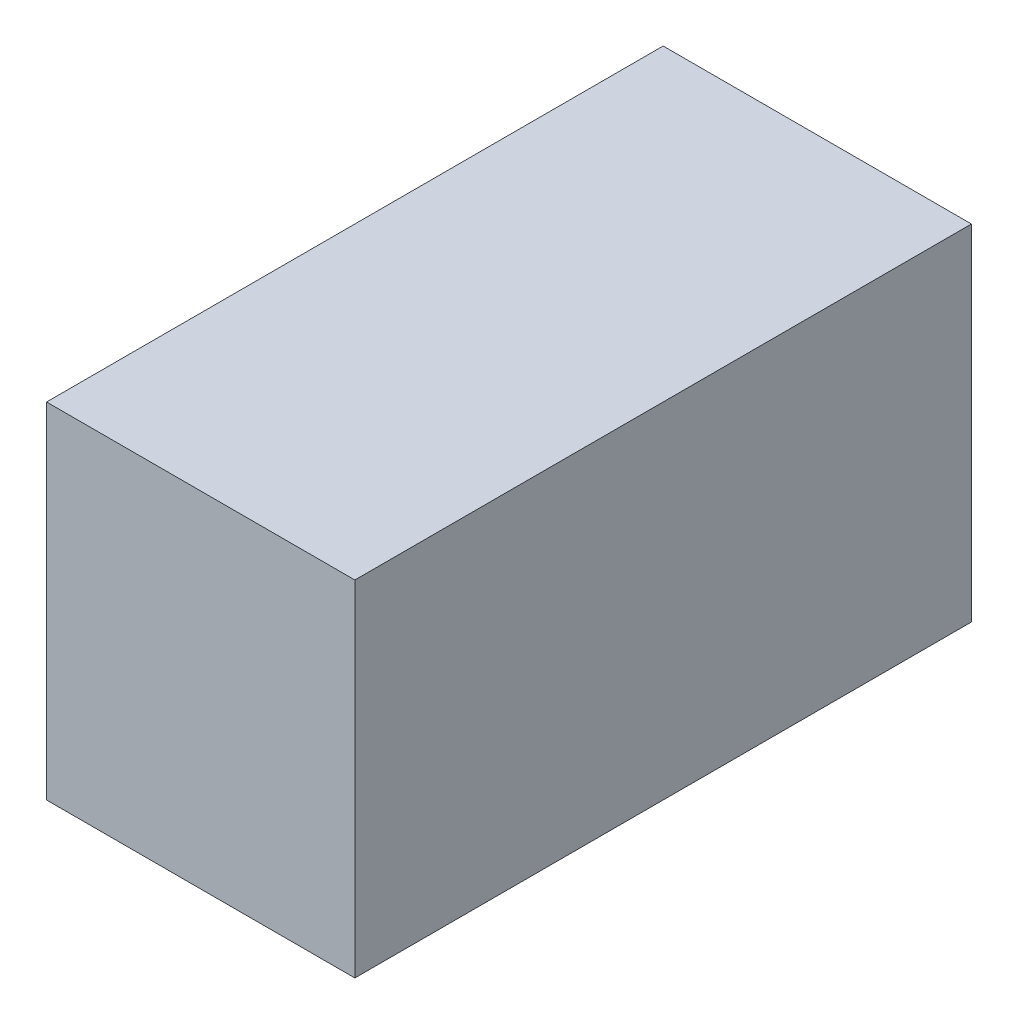
ISO-10303-21;
HEADER;
FILE_DESCRIPTION(('STEP AP214'),'2;1');
FILE_NAME('part.step','',(''),(''),'','','');
FILE_SCHEMA(('AUTOMOTIVE_DESIGN { 1 0 10303 214 1 1 1 1 }'));
ENDSEC;
DATA;
#1=APPLICATION_CONTEXT('core data for automotive mechanical design processes');
#2=APPLICATION_PROTOCOL_DEFINITION('international standard','automotive_design',2000,#1);
#3=PRODUCT_CONTEXT('',#1,'mechanical');
#4=PRODUCT('Part','Part','',(#3));
#5=PRODUCT_RELATED_PRODUCT_CATEGORY('part','',(#4));
#6=PRODUCT_DEFINITION_FORMATION('','',#4);
#7=PRODUCT_DEFINITION_CONTEXT('part definition',#1,'design');
#8=PRODUCT_DEFINITION('design','',#6,#7);
#9=PRODUCT_DEFINITION_SHAPE('','',#8);
#10=(LENGTH_UNIT() NAMED_UNIT(*) SI_UNIT(.MILLI.,.METRE.));
#11=(NAMED_UNIT(*) PLANE_ANGLE_UNIT() SI_UNIT($,.RADIAN.));
#12=(NAMED_UNIT(*) SI_UNIT($,.STERADIAN.) SOLID_ANGLE_UNIT());
#13=UNCERTAINTY_MEASURE_WITH_UNIT(LENGTH_MEASURE(1.E-05),#10,'distance_accuracy_value','');
#14=(GEOMETRIC_REPRESENTATION_CONTEXT(3) GLOBAL_UNCERTAINTY_ASSIGNED_CONTEXT((#13)) GLOBAL_UNIT_ASSIGNED_CONTEXT((#10,
#11,#12)) REPRESENTATION_CONTEXT('',''));
#15=CARTESIAN_POINT('',(0.,0.,0.));
#16=DIRECTION('',(0.,0.,1.));
#17=DIRECTION('',(1.,0.,0.));
#18=AXIS2_PLACEMENT_3D('',#15,#16,#17);
#19=CARTESIAN_POINT('',(25.4,28.4,-50.8));
#20=DIRECTION('',(-1.,0.,0.));
#21=DIRECTION('',(0.,0.,1.));
#22=AXIS2_PLACEMENT_3D('',#19,#20,#21);
#23=PLANE('',#22);
#24=DIRECTION('',(0.,0.,-1.));
#25=VECTOR('',#24,1.);
#26=CARTESIAN_POINT('',(25.4,-28.4,-50.8));
#27=LINE('',#26,#25);
#28=CARTESIAN_POINT('',(25.4,-28.4,50.8));
#29=VERTEX_POINT('',#28);
#30=CARTESIAN_POINT('',(25.4,-28.4,-50.8));
#31=VERTEX_POINT('',#30);
#32=EDGE_CURVE('E113',#29,#31,#27,.T.);
#33=ORIENTED_EDGE('',*,*,#32,.T.);
#34=DIRECTION('',(0.,-1.,0.));
#35=VECTOR('',#34,1.);
#36=CARTESIAN_POINT('',(25.4,28.4,-50.8));
#37=LINE('',#36,#35);
#38=CARTESIAN_POINT('',(25.4,28.4,-50.8));
#39=VERTEX_POINT('',#38);
#40=EDGE_CURVE('E11',#39,#31,#37,.T.);
#41=ORIENTED_EDGE('',*,*,#40,.F.);
#42=DIRECTION('',(0.,0.,-1.));
#43=VECTOR('',#42,1.);
#44=CARTESIAN_POINT('',(25.4,28.4,-50.8));
#45=LINE('',#44,#43);
#46=CARTESIAN_POINT('',(25.4,28.4,50.8));
#47=VERTEX_POINT('',#46);
#48=EDGE_CURVE('E97',#47,#39,#45,.T.);
#49=ORIENTED_EDGE('',*,*,#48,.F.);
#50=DIRECTION('',(0.,-1.,0.));
#51=VECTOR('',#50,1.);
#52=CARTESIAN_POINT('',(25.4,28.4,50.8));
#53=LINE('',#52,#51);
#54=EDGE_CURVE('E109',#47,#29,#53,.T.);
#55=ORIENTED_EDGE('',*,*,#54,.T.);
#56=EDGE_LOOP('',(#33,#41,#49,#55));
#57=FACE_BOUND('',#56,.T.);
#58=ADVANCED_FACE('F45',(#57),#23,.F.);
#59=CARTESIAN_POINT('',(-25.4,28.4,-50.8));
#60=DIRECTION('',(0.,0.,1.));
#61=DIRECTION('',(1.,0.,0.));
#62=AXIS2_PLACEMENT_3D('',#59,#60,#61);
#63=PLANE('',#62);
#64=DIRECTION('',(-1.,0.,0.));
#65=VECTOR('',#64,1.);
#66=CARTESIAN_POINT('',(-25.4,-28.4,-50.8));
#67=LINE('',#66,#65);
#68=CARTESIAN_POINT('',(-25.4,-28.4,-50.8));
#69=VERTEX_POINT('',#68);
#70=EDGE_CURVE('E102',#31,#69,#67,.T.);
#71=ORIENTED_EDGE('',*,*,#70,.T.);
#72=DIRECTION('',(0.,-1.,0.));
#73=VECTOR('',#72,1.);
#74=CARTESIAN_POINT('',(-25.4,28.4,-50.8));
#75=LINE('',#74,#73);
#76=CARTESIAN_POINT('',(-25.4,28.4,-50.8));
#77=VERTEX_POINT('',#76);
#78=EDGE_CURVE('E54',#77,#69,#75,.T.);
#79=ORIENTED_EDGE('',*,*,#78,.F.);
#80=DIRECTION('',(-1.,0.,0.));
#81=VECTOR('',#80,1.);
#82=CARTESIAN_POINT('',(-25.4,28.4,-50.8));
#83=LINE('',#82,#81);
#84=EDGE_CURVE('E92',#39,#77,#83,.T.);
#85=ORIENTED_EDGE('',*,*,#84,.F.);
#86=ORIENTED_EDGE('',*,*,#40,.T.);
#87=EDGE_LOOP('',(#71,#79,#85,#86));
#88=FACE_BOUND('',#87,.T.);
#89=ADVANCED_FACE('F101',(#88),#63,.F.);
#90=CARTESIAN_POINT('',(-25.4,28.4,-50.8));
#91=DIRECTION('',(1.,0.,0.));
#92=DIRECTION('',(0.,0.,-1.));
#93=AXIS2_PLACEMENT_3D('',#90,#91,#92);
#94=PLANE('',#93);
#95=DIRECTION('',(0.,0.,1.));
#96=VECTOR('',#95,1.);
#97=CARTESIAN_POINT('',(-25.4,-28.4,-50.8));
#98=LINE('',#97,#96);
#99=CARTESIAN_POINT('',(-25.4,-28.4,50.8));
#100=VERTEX_POINT('',#99);
#101=EDGE_CURVE('E79',#69,#100,#98,.T.);
#102=ORIENTED_EDGE('',*,*,#101,.T.);
#103=DIRECTION('',(0.,-1.,0.));
#104=VECTOR('',#103,1.);
#105=CARTESIAN_POINT('',(-25.4,28.4,50.8));
#106=LINE('',#105,#104);
#107=CARTESIAN_POINT('',(-25.4,28.4,50.8));
#108=VERTEX_POINT('',#107);
#109=EDGE_CURVE('E104',#108,#100,#106,.T.);
#110=ORIENTED_EDGE('',*,*,#109,.F.);
#111=DIRECTION('',(0.,0.,1.));
#112=VECTOR('',#111,1.);
#113=CARTESIAN_POINT('',(-25.4,28.4,-50.8));
#114=LINE('',#113,#112);
#115=EDGE_CURVE('E95',#77,#108,#114,.T.);
#116=ORIENTED_EDGE('',*,*,#115,.F.);
#117=ORIENTED_EDGE('',*,*,#78,.T.);
#118=EDGE_LOOP('',(#102,#110,#116,#117));
#119=FACE_BOUND('',#118,.T.);
#120=ADVANCED_FACE('F105',(#119),#94,.F.);
#121=CARTESIAN_POINT('',(-25.4,28.4,50.8));
#122=DIRECTION('',(0.,0.,-1.));
#123=DIRECTION('',(-1.,0.,0.));
#124=AXIS2_PLACEMENT_3D('',#121,#122,#123);
#125=PLANE('',#124);
#126=DIRECTION('',(1.,0.,0.));
#127=VECTOR('',#126,1.);
#128=CARTESIAN_POINT('',(-25.4,-28.4,50.8));
#129=LINE('',#128,#127);
#130=EDGE_CURVE('E85',#100,#29,#129,.T.);
#131=ORIENTED_EDGE('',*,*,#130,.T.);
#132=ORIENTED_EDGE('',*,*,#54,.F.);
#133=DIRECTION('',(1.,0.,0.));
#134=VECTOR('',#133,1.);
#135=CARTESIAN_POINT('',(-25.4,28.4,50.8));
#136=LINE('',#135,#134);
#137=EDGE_CURVE('E62',#108,#47,#136,.T.);
#138=ORIENTED_EDGE('',*,*,#137,.F.);
#139=ORIENTED_EDGE('',*,*,#109,.T.);
#140=EDGE_LOOP('',(#131,#132,#138,#139));
#141=FACE_BOUND('',#140,.T.);
#142=ADVANCED_FACE('F126',(#141),#125,.F.);
#143=CARTESIAN_POINT('',(0.,28.4,0.));
#144=DIRECTION('',(0.,1.,0.));
#145=DIRECTION('',(0.,0.,1.));
#146=AXIS2_PLACEMENT_3D('',#143,#144,#145);
#147=PLANE('',#146);
#148=ORIENTED_EDGE('',*,*,#48,.T.);
#149=ORIENTED_EDGE('',*,*,#84,.T.);
#150=ORIENTED_EDGE('',*,*,#115,.T.);
#151=ORIENTED_EDGE('',*,*,#137,.T.);
#152=EDGE_LOOP('',(#148,#149,#150,#151));
#153=FACE_BOUND('',#152,.T.);
#154=ADVANCED_FACE('F93',(#153),#147,.T.);
#155=CARTESIAN_POINT('',(0.,-28.4,0.));
#156=DIRECTION('',(0.,1.,0.));
#157=DIRECTION('',(0.,0.,1.));
#158=AXIS2_PLACEMENT_3D('',#155,#156,#157);
#159=PLANE('',#158);
#160=ORIENTED_EDGE('',*,*,#32,.F.);
#161=ORIENTED_EDGE('',*,*,#130,.F.);
#162=ORIENTED_EDGE('',*,*,#101,.F.);
#163=ORIENTED_EDGE('',*,*,#70,.F.);
#164=EDGE_LOOP('',(#160,#161,#162,#163));
#165=FACE_BOUND('',#164,.T.);
#166=ADVANCED_FACE('F129',(#165),#159,.F.);
#167=CLOSED_SHELL('',(#58,#89,#120,#142,#154,#166));
#168=MANIFOLD_SOLID_BREP('B2',#167);
#169=ADVANCED_BREP_SHAPE_REPRESENTATION('',(#18,#168),#14);
#170=SHAPE_DEFINITION_REPRESENTATION(#9,#169);
ENDSEC;
END-ISO-10303-21;
